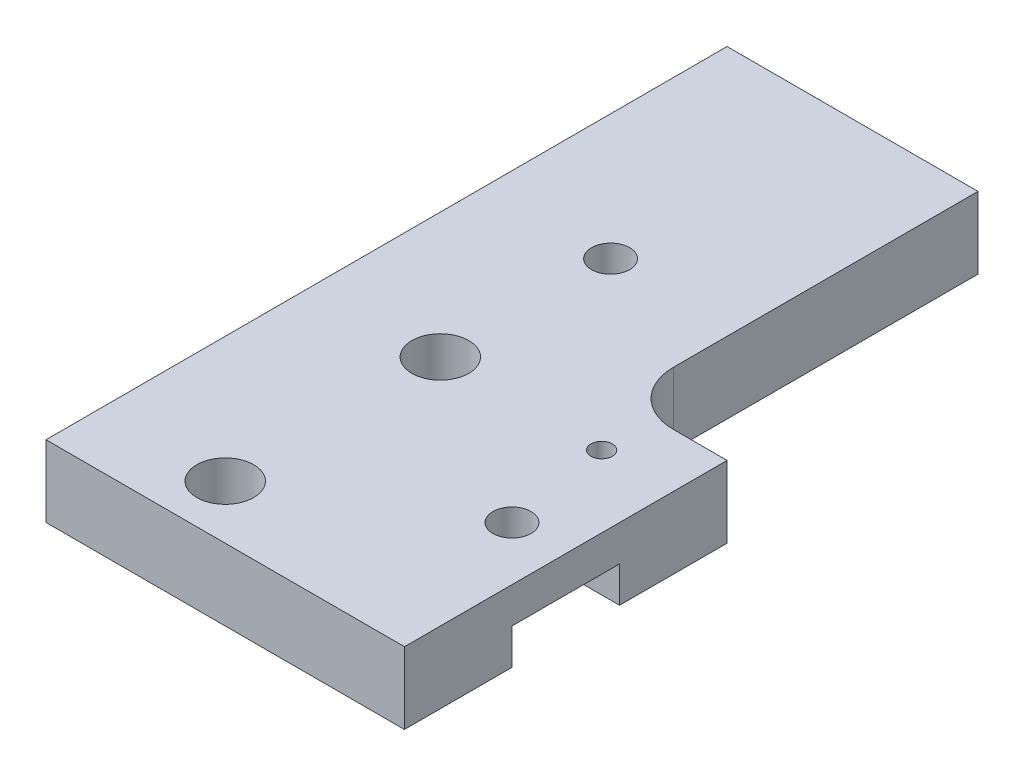
ISO-10303-21;
HEADER;
FILE_DESCRIPTION(('STEP AP214'),'2;1');
FILE_NAME('part.step','',(''),(''),'','','');
FILE_SCHEMA(('AUTOMOTIVE_DESIGN { 1 0 10303 214 1 1 1 1 }'));
ENDSEC;
DATA;
#1=APPLICATION_CONTEXT('core data for automotive mechanical design processes');
#2=APPLICATION_PROTOCOL_DEFINITION('international standard','automotive_design',2000,#1);
#3=PRODUCT_CONTEXT('',#1,'mechanical');
#4=PRODUCT('Part','Part','',(#3));
#5=PRODUCT_RELATED_PRODUCT_CATEGORY('part','',(#4));
#6=PRODUCT_DEFINITION_FORMATION('','',#4);
#7=PRODUCT_DEFINITION_CONTEXT('part definition',#1,'design');
#8=PRODUCT_DEFINITION('design','',#6,#7);
#9=PRODUCT_DEFINITION_SHAPE('','',#8);
#10=(LENGTH_UNIT() NAMED_UNIT(*) SI_UNIT(.MILLI.,.METRE.));
#11=(NAMED_UNIT(*) PLANE_ANGLE_UNIT() SI_UNIT($,.RADIAN.));
#12=(NAMED_UNIT(*) SI_UNIT($,.STERADIAN.) SOLID_ANGLE_UNIT());
#13=UNCERTAINTY_MEASURE_WITH_UNIT(LENGTH_MEASURE(1.E-05),#10,'distance_accuracy_value','');
#14=(GEOMETRIC_REPRESENTATION_CONTEXT(3) GLOBAL_UNCERTAINTY_ASSIGNED_CONTEXT((#13)) GLOBAL_UNIT_ASSIGNED_CONTEXT((#10,
#11,#12)) REPRESENTATION_CONTEXT('',''));
#15=CARTESIAN_POINT('',(0.,0.,0.));
#16=DIRECTION('',(0.,0.,1.));
#17=DIRECTION('',(1.,0.,0.));
#18=AXIS2_PLACEMENT_3D('',#15,#16,#17);
#19=CARTESIAN_POINT('',(0.,0.,0.));
#20=DIRECTION('',(0.,-1.,0.));
#21=DIRECTION('',(0.,0.,-1.));
#22=AXIS2_PLACEMENT_3D('',#19,#20,#21);
#23=PLANE('',#22);
#24=CARTESIAN_POINT('',(19.05,0.,-19.05));
#25=DIRECTION('',(0.,1.,0.));
#26=DIRECTION('',(0.,0.,1.));
#27=AXIS2_PLACEMENT_3D('',#24,#25,#26);
#28=CIRCLE('',#27,1.89864999999999);
#29=CARTESIAN_POINT('',(19.05,0.,-17.15135));
#30=VERTEX_POINT('',#29);
#31=EDGE_CURVE('E233',#30,#30,#28,.T.);
#32=ORIENTED_EDGE('',*,*,#31,.T.);
#33=EDGE_LOOP('',(#32));
#34=FACE_BOUND('',#33,.T.);
#35=DIRECTION('',(0.,0.,-1.));
#36=VECTOR('',#35,1.);
#37=CARTESIAN_POINT('',(12.7,0.,-92.075));
#38=LINE('',#37,#36);
#39=CARTESIAN_POINT('',(12.7,0.,-38.1));
#40=VERTEX_POINT('',#39);
#41=CARTESIAN_POINT('',(12.7,0.,-92.075));
#42=VERTEX_POINT('',#41);
#43=EDGE_CURVE('E160',#40,#42,#38,.T.);
#44=ORIENTED_EDGE('',*,*,#43,.F.);
#45=CARTESIAN_POINT('',(22.225,0.,-38.1));
#46=DIRECTION('',(0.,-1.,0.));
#47=DIRECTION('',(0.,0.,-1.));
#48=AXIS2_PLACEMENT_3D('',#45,#46,#47);
#49=CIRCLE('',#48,9.525);
#50=CARTESIAN_POINT('',(22.225,0.,-28.575));
#51=VERTEX_POINT('',#50);
#52=EDGE_CURVE('E45',#40,#51,#49,.F.);
#53=ORIENTED_EDGE('',*,*,#52,.T.);
#54=DIRECTION('',(-1.,0.,0.));
#55=VECTOR('',#54,1.);
#56=CARTESIAN_POINT('',(12.7,0.,-28.575));
#57=LINE('',#56,#55);
#58=CARTESIAN_POINT('',(31.75,0.,-28.575));
#59=VERTEX_POINT('',#58);
#60=EDGE_CURVE('E231',#59,#51,#57,.T.);
#61=ORIENTED_EDGE('',*,*,#60,.F.);
#62=DIRECTION('',(0.,0.,-1.));
#63=VECTOR('',#62,1.);
#64=CARTESIAN_POINT('',(31.75,0.,28.575));
#65=LINE('',#64,#63);
#66=CARTESIAN_POINT('',(31.75,0.,-9.525));
#67=VERTEX_POINT('',#66);
#68=EDGE_CURVE('E170',#67,#59,#65,.T.);
#69=ORIENTED_EDGE('',*,*,#68,.F.);
#70=DIRECTION('',(1.,0.,0.));
#71=VECTOR('',#70,1.);
#72=CARTESIAN_POINT('',(-31.75,0.,-9.525));
#73=LINE('',#72,#71);
#74=CARTESIAN_POINT('',(-31.75,0.,-9.525));
#75=VERTEX_POINT('',#74);
#76=EDGE_CURVE('E300',#75,#67,#73,.T.);
#77=ORIENTED_EDGE('',*,*,#76,.F.);
#78=DIRECTION('',(0.,0.,1.));
#79=VECTOR('',#78,1.);
#80=CARTESIAN_POINT('',(-31.75,0.,28.575));
#81=LINE('',#80,#79);
#82=CARTESIAN_POINT('',(-31.75,0.,-92.075));
#83=VERTEX_POINT('',#82);
#84=EDGE_CURVE('E181',#83,#75,#81,.T.);
#85=ORIENTED_EDGE('',*,*,#84,.F.);
#86=DIRECTION('',(-1.,0.,0.));
#87=VECTOR('',#86,1.);
#88=CARTESIAN_POINT('',(-31.75,0.,-92.075));
#89=LINE('',#88,#87);
#90=CARTESIAN_POINT('',(-19.05,0.,-92.075));
#91=VERTEX_POINT('',#90);
#92=EDGE_CURVE('E281',#91,#83,#89,.T.);
#93=ORIENTED_EDGE('',*,*,#92,.F.);
#94=DIRECTION('',(0.,0.,-1.));
#95=VECTOR('',#94,1.);
#96=CARTESIAN_POINT('',(-19.05,0.,-92.075));
#97=LINE('',#96,#95);
#98=CARTESIAN_POINT('',(-19.05,0.,-36.5125));
#99=VERTEX_POINT('',#98);
#100=EDGE_CURVE('E250',#99,#91,#97,.T.);
#101=ORIENTED_EDGE('',*,*,#100,.F.);
#102=CARTESIAN_POINT('',(-14.2875,0.,-36.5125));
#103=DIRECTION('',(0.,-1.,0.));
#104=DIRECTION('',(0.,0.,-1.));
#105=AXIS2_PLACEMENT_3D('',#102,#103,#104);
#106=CIRCLE('',#105,4.7625);
#107=CARTESIAN_POINT('',(-14.2875,0.,-31.75));
#108=VERTEX_POINT('',#107);
#109=EDGE_CURVE('E215',#99,#108,#106,.F.);
#110=ORIENTED_EDGE('',*,*,#109,.T.);
#111=DIRECTION('',(-1.,0.,0.));
#112=VECTOR('',#111,1.);
#113=CARTESIAN_POINT('',(-19.05,0.,-31.75));
#114=LINE('',#113,#112);
#115=CARTESIAN_POINT('',(-4.76250000000001,0.,-31.75));
#116=VERTEX_POINT('',#115);
#117=EDGE_CURVE('E251',#116,#108,#114,.T.);
#118=ORIENTED_EDGE('',*,*,#117,.F.);
#119=CARTESIAN_POINT('',(-4.7625,0.,-36.5125));
#120=DIRECTION('',(0.,-1.,0.));
#121=DIRECTION('',(0.,0.,-1.));
#122=AXIS2_PLACEMENT_3D('',#119,#120,#121);
#123=CIRCLE('',#122,4.7625);
#124=CARTESIAN_POINT('',(0.,0.,-36.5125));
#125=VERTEX_POINT('',#124);
#126=EDGE_CURVE('E213',#116,#125,#123,.F.);
#127=ORIENTED_EDGE('',*,*,#126,.T.);
#128=DIRECTION('',(0.,0.,1.));
#129=VECTOR('',#128,1.);
#130=CARTESIAN_POINT('',(0.,0.,-92.075));
#131=LINE('',#130,#129);
#132=CARTESIAN_POINT('',(0.,0.,-92.075));
#133=VERTEX_POINT('',#132);
#134=EDGE_CURVE('E255',#133,#125,#131,.T.);
#135=ORIENTED_EDGE('',*,*,#134,.F.);
#136=EDGE_CURVE('E230',#42,#133,#89,.T.);
#137=ORIENTED_EDGE('',*,*,#136,.F.);
#138=EDGE_LOOP('',(#44,#53,#61,#69,#77,#85,#93,#101,#110,#118,#127,#135,#137));
#139=FACE_BOUND('',#138,.T.);
#140=CARTESIAN_POINT('',(-9.525,0.,-19.05));
#141=DIRECTION('',(0.,1.,0.));
#142=DIRECTION('',(0.,0.,1.));
#143=AXIS2_PLACEMENT_3D('',#140,#141,#142);
#144=CIRCLE('',#143,5.0419);
#145=CARTESIAN_POINT('',(-9.525,0.,-14.0081));
#146=VERTEX_POINT('',#145);
#147=EDGE_CURVE('E286',#146,#146,#144,.T.);
#148=ORIENTED_EDGE('',*,*,#147,.T.);
#149=EDGE_LOOP('',(#148));
#150=FACE_BOUND('',#149,.T.);
#151=ADVANCED_FACE('F37',(#34,#139,#150),#23,.T.);
#152=CARTESIAN_POINT('',(31.75,12.7,28.575));
#153=DIRECTION('',(-1.,0.,0.));
#154=DIRECTION('',(0.,0.,1.));
#155=AXIS2_PLACEMENT_3D('',#152,#153,#154);
#156=PLANE('',#155);
#157=ORIENTED_EDGE('',*,*,#68,.T.);
#158=DIRECTION('',(0.,-1.,0.));
#159=VECTOR('',#158,1.);
#160=CARTESIAN_POINT('',(31.75,12.7,-28.575));
#161=LINE('',#160,#159);
#162=CARTESIAN_POINT('',(31.75,12.7,-28.575));
#163=VERTEX_POINT('',#162);
#164=EDGE_CURVE('E155',#163,#59,#161,.T.);
#165=ORIENTED_EDGE('',*,*,#164,.F.);
#166=DIRECTION('',(0.,0.,-1.));
#167=VECTOR('',#166,1.);
#168=CARTESIAN_POINT('',(31.75,12.7,28.575));
#169=LINE('',#168,#167);
#170=CARTESIAN_POINT('',(31.75,12.7,28.575));
#171=VERTEX_POINT('',#170);
#172=EDGE_CURVE('E167',#171,#163,#169,.T.);
#173=ORIENTED_EDGE('',*,*,#172,.F.);
#174=DIRECTION('',(0.,-1.,0.));
#175=VECTOR('',#174,1.);
#176=CARTESIAN_POINT('',(31.75,12.7,28.575));
#177=LINE('',#176,#175);
#178=CARTESIAN_POINT('',(31.75,0.,28.575));
#179=VERTEX_POINT('',#178);
#180=EDGE_CURVE('E188',#171,#179,#177,.T.);
#181=ORIENTED_EDGE('',*,*,#180,.T.);
#182=CARTESIAN_POINT('',(31.75,0.,9.525));
#183=VERTEX_POINT('',#182);
#184=EDGE_CURVE('E189',#179,#183,#65,.T.);
#185=ORIENTED_EDGE('',*,*,#184,.T.);
#186=DIRECTION('',(0.,-1.,0.));
#187=VECTOR('',#186,1.);
#188=CARTESIAN_POINT('',(31.75,6.35,9.525));
#189=LINE('',#188,#187);
#190=CARTESIAN_POINT('',(31.75,6.35,9.525));
#191=VERTEX_POINT('',#190);
#192=EDGE_CURVE('E184',#191,#183,#189,.T.);
#193=ORIENTED_EDGE('',*,*,#192,.F.);
#194=DIRECTION('',(0.,0.,1.));
#195=VECTOR('',#194,1.);
#196=CARTESIAN_POINT('',(31.75,6.35,-9.525));
#197=LINE('',#196,#195);
#198=CARTESIAN_POINT('',(31.75,6.35,-9.525));
#199=VERTEX_POINT('',#198);
#200=EDGE_CURVE('E296',#199,#191,#197,.T.);
#201=ORIENTED_EDGE('',*,*,#200,.F.);
#202=DIRECTION('',(0.,-1.,0.));
#203=VECTOR('',#202,1.);
#204=CARTESIAN_POINT('',(31.75,6.35,-9.525));
#205=LINE('',#204,#203);
#206=EDGE_CURVE('E310',#199,#67,#205,.T.);
#207=ORIENTED_EDGE('',*,*,#206,.T.);
#208=EDGE_LOOP('',(#157,#165,#173,#181,#185,#193,#201,#207));
#209=FACE_BOUND('',#208,.T.);
#210=ADVANCED_FACE('F165',(#209),#156,.F.);
#211=CARTESIAN_POINT('',(-31.75,12.7,28.575));
#212=DIRECTION('',(1.,0.,0.));
#213=DIRECTION('',(0.,0.,-1.));
#214=AXIS2_PLACEMENT_3D('',#211,#212,#213);
#215=PLANE('',#214);
#216=ORIENTED_EDGE('',*,*,#84,.T.);
#217=DIRECTION('',(0.,-1.,0.));
#218=VECTOR('',#217,1.);
#219=CARTESIAN_POINT('',(-31.75,6.35,-9.525));
#220=LINE('',#219,#218);
#221=CARTESIAN_POINT('',(-31.75,6.35,-9.525));
#222=VERTEX_POINT('',#221);
#223=EDGE_CURVE('E312',#222,#75,#220,.T.);
#224=ORIENTED_EDGE('',*,*,#223,.F.);
#225=DIRECTION('',(0.,0.,-1.));
#226=VECTOR('',#225,1.);
#227=CARTESIAN_POINT('',(-31.75,6.35,-9.525));
#228=LINE('',#227,#226);
#229=CARTESIAN_POINT('',(-31.75,6.35,9.525));
#230=VERTEX_POINT('',#229);
#231=EDGE_CURVE('E303',#230,#222,#228,.T.);
#232=ORIENTED_EDGE('',*,*,#231,.F.);
#233=DIRECTION('',(0.,-1.,0.));
#234=VECTOR('',#233,1.);
#235=CARTESIAN_POINT('',(-31.75,6.35,9.525));
#236=LINE('',#235,#234);
#237=CARTESIAN_POINT('',(-31.75,0.,9.525));
#238=VERTEX_POINT('',#237);
#239=EDGE_CURVE('E313',#230,#238,#236,.T.);
#240=ORIENTED_EDGE('',*,*,#239,.T.);
#241=CARTESIAN_POINT('',(-31.75,0.,28.575));
#242=VERTEX_POINT('',#241);
#243=EDGE_CURVE('E192',#238,#242,#81,.T.);
#244=ORIENTED_EDGE('',*,*,#243,.T.);
#245=DIRECTION('',(0.,-1.,0.));
#246=VECTOR('',#245,1.);
#247=CARTESIAN_POINT('',(-31.75,12.7,28.575));
#248=LINE('',#247,#246);
#249=CARTESIAN_POINT('',(-31.75,12.7,28.575));
#250=VERTEX_POINT('',#249);
#251=EDGE_CURVE('E196',#250,#242,#248,.T.);
#252=ORIENTED_EDGE('',*,*,#251,.F.);
#253=DIRECTION('',(0.,0.,1.));
#254=VECTOR('',#253,1.);
#255=CARTESIAN_POINT('',(-31.75,12.7,28.575));
#256=LINE('',#255,#254);
#257=CARTESIAN_POINT('',(-31.75,12.7,-92.075));
#258=VERTEX_POINT('',#257);
#259=EDGE_CURVE('E177',#258,#250,#256,.T.);
#260=ORIENTED_EDGE('',*,*,#259,.F.);
#261=DIRECTION('',(0.,1.,0.));
#262=VECTOR('',#261,1.);
#263=CARTESIAN_POINT('',(-31.75,12.7,-92.075));
#264=LINE('',#263,#262);
#265=EDGE_CURVE('E275',#83,#258,#264,.T.);
#266=ORIENTED_EDGE('',*,*,#265,.F.);
#267=EDGE_LOOP('',(#216,#224,#232,#240,#244,#252,#260,#266));
#268=FACE_BOUND('',#267,.T.);
#269=ADVANCED_FACE('F330',(#268),#215,.F.);
#270=CARTESIAN_POINT('',(-31.75,12.7,28.575));
#271=DIRECTION('',(0.,0.,-1.));
#272=DIRECTION('',(-1.,0.,0.));
#273=AXIS2_PLACEMENT_3D('',#270,#271,#272);
#274=PLANE('',#273);
#275=DIRECTION('',(1.,0.,0.));
#276=VECTOR('',#275,1.);
#277=CARTESIAN_POINT('',(-31.75,0.,28.575));
#278=LINE('',#277,#276);
#279=EDGE_CURVE('E178',#242,#179,#278,.T.);
#280=ORIENTED_EDGE('',*,*,#279,.T.);
#281=ORIENTED_EDGE('',*,*,#180,.F.);
#282=DIRECTION('',(1.,0.,0.));
#283=VECTOR('',#282,1.);
#284=CARTESIAN_POINT('',(-31.75,12.7,28.575));
#285=LINE('',#284,#283);
#286=EDGE_CURVE('E175',#250,#171,#285,.T.);
#287=ORIENTED_EDGE('',*,*,#286,.F.);
#288=ORIENTED_EDGE('',*,*,#251,.T.);
#289=EDGE_LOOP('',(#280,#281,#287,#288));
#290=FACE_BOUND('',#289,.T.);
#291=ADVANCED_FACE('F328',(#290),#274,.F.);
#292=CARTESIAN_POINT('',(0.,12.7,0.));
#293=DIRECTION('',(0.,-1.,0.));
#294=DIRECTION('',(0.,0.,-1.));
#295=AXIS2_PLACEMENT_3D('',#292,#293,#294);
#296=PLANE('',#295);
#297=CARTESIAN_POINT('',(19.05,12.7,-19.05));
#298=DIRECTION('',(0.,1.,0.));
#299=DIRECTION('',(0.,0.,1.));
#300=AXIS2_PLACEMENT_3D('',#297,#298,#299);
#301=CIRCLE('',#300,1.89864999999999);
#302=CARTESIAN_POINT('',(19.05,12.7,-17.15135));
#303=VERTEX_POINT('',#302);
#304=EDGE_CURVE('E606',#303,#303,#301,.T.);
#305=ORIENTED_EDGE('',*,*,#304,.F.);
#306=EDGE_LOOP('',(#305));
#307=FACE_BOUND('',#306,.T.);
#308=CARTESIAN_POINT('',(22.225,12.7,0.));
#309=DIRECTION('',(0.,-1.,0.));
#310=DIRECTION('',(0.,0.,-1.));
#311=AXIS2_PLACEMENT_3D('',#308,#309,#310);
#312=CIRCLE('',#311,3.3782);
#313=CARTESIAN_POINT('',(22.225,12.7,-3.3782));
#314=VERTEX_POINT('',#313);
#315=EDGE_CURVE('E241',#314,#314,#312,.T.);
#316=ORIENTED_EDGE('',*,*,#315,.T.);
#317=EDGE_LOOP('',(#316));
#318=FACE_BOUND('',#317,.T.);
#319=CARTESIAN_POINT('',(-9.525,12.7,-49.2125));
#320=DIRECTION('',(0.,-1.,0.));
#321=DIRECTION('',(0.,0.,-1.));
#322=AXIS2_PLACEMENT_3D('',#319,#320,#321);
#323=CIRCLE('',#322,3.3782);
#324=CARTESIAN_POINT('',(-9.525,12.7,-52.5907));
#325=VERTEX_POINT('',#324);
#326=EDGE_CURVE('E247',#325,#325,#323,.T.);
#327=ORIENTED_EDGE('',*,*,#326,.T.);
#328=EDGE_LOOP('',(#327));
#329=FACE_BOUND('',#328,.T.);
#330=CARTESIAN_POINT('',(-9.525,12.7,-19.05));
#331=DIRECTION('',(0.,1.,0.));
#332=DIRECTION('',(0.,0.,1.));
#333=AXIS2_PLACEMENT_3D('',#330,#331,#332);
#334=CIRCLE('',#333,5.0419);
#335=CARTESIAN_POINT('',(-9.525,12.7,-14.0081));
#336=VERTEX_POINT('',#335);
#337=EDGE_CURVE('E283',#336,#336,#334,.T.);
#338=ORIENTED_EDGE('',*,*,#337,.F.);
#339=EDGE_LOOP('',(#338));
#340=FACE_BOUND('',#339,.T.);
#341=CARTESIAN_POINT('',(-9.525,12.7,19.05));
#342=DIRECTION('',(0.,1.,0.));
#343=DIRECTION('',(0.,0.,1.));
#344=AXIS2_PLACEMENT_3D('',#341,#342,#343);
#345=CIRCLE('',#344,5.0419);
#346=CARTESIAN_POINT('',(-9.525,12.7,24.0919));
#347=VERTEX_POINT('',#346);
#348=EDGE_CURVE('E289',#347,#347,#345,.T.);
#349=ORIENTED_EDGE('',*,*,#348,.F.);
#350=EDGE_LOOP('',(#349));
#351=FACE_BOUND('',#350,.T.);
#352=DIRECTION('',(-1.,0.,0.));
#353=VECTOR('',#352,1.);
#354=CARTESIAN_POINT('',(12.7,12.7,-28.575));
#355=LINE('',#354,#353);
#356=CARTESIAN_POINT('',(22.225,12.7,-28.575));
#357=VERTEX_POINT('',#356);
#358=EDGE_CURVE('E152',#163,#357,#355,.T.);
#359=ORIENTED_EDGE('',*,*,#358,.T.);
#360=CARTESIAN_POINT('',(22.225,12.7,-38.1));
#361=DIRECTION('',(0.,-1.,0.));
#362=DIRECTION('',(0.,0.,-1.));
#363=AXIS2_PLACEMENT_3D('',#360,#361,#362);
#364=CIRCLE('',#363,9.525);
#365=CARTESIAN_POINT('',(12.7,12.7,-38.1));
#366=VERTEX_POINT('',#365);
#367=EDGE_CURVE('E11',#357,#366,#364,.T.);
#368=ORIENTED_EDGE('',*,*,#367,.T.);
#369=DIRECTION('',(0.,0.,-1.));
#370=VECTOR('',#369,1.);
#371=CARTESIAN_POINT('',(12.7,12.7,-92.075));
#372=LINE('',#371,#370);
#373=CARTESIAN_POINT('',(12.7,12.7,-92.075));
#374=VERTEX_POINT('',#373);
#375=EDGE_CURVE('E159',#366,#374,#372,.T.);
#376=ORIENTED_EDGE('',*,*,#375,.T.);
#377=DIRECTION('',(1.,0.,0.));
#378=VECTOR('',#377,1.);
#379=CARTESIAN_POINT('',(-31.75,12.7,-92.075));
#380=LINE('',#379,#378);
#381=EDGE_CURVE('E278',#258,#374,#380,.T.);
#382=ORIENTED_EDGE('',*,*,#381,.F.);
#383=ORIENTED_EDGE('',*,*,#259,.T.);
#384=ORIENTED_EDGE('',*,*,#286,.T.);
#385=ORIENTED_EDGE('',*,*,#172,.T.);
#386=EDGE_LOOP('',(#359,#368,#376,#382,#383,#384,#385));
#387=FACE_BOUND('',#386,.T.);
#388=ADVANCED_FACE('F173',(#307,#318,#329,#340,#351,#387),#296,.F.);
#389=CARTESIAN_POINT('',(-9.525,0.,19.05));
#390=DIRECTION('',(0.,1.,0.));
#391=DIRECTION('',(0.,0.,1.));
#392=AXIS2_PLACEMENT_3D('',#389,#390,#391);
#393=CIRCLE('',#392,5.0419);
#394=CARTESIAN_POINT('',(-9.525,0.,24.0919));
#395=VERTEX_POINT('',#394);
#396=EDGE_CURVE('E292',#395,#395,#393,.T.);
#397=ORIENTED_EDGE('',*,*,#396,.T.);
#398=EDGE_LOOP('',(#397));
#399=FACE_BOUND('',#398,.T.);
#400=DIRECTION('',(-1.,0.,0.));
#401=VECTOR('',#400,1.);
#402=CARTESIAN_POINT('',(-31.75,0.,9.525));
#403=LINE('',#402,#401);
#404=EDGE_CURVE('E295',#183,#238,#403,.T.);
#405=ORIENTED_EDGE('',*,*,#404,.F.);
#406=ORIENTED_EDGE('',*,*,#184,.F.);
#407=ORIENTED_EDGE('',*,*,#279,.F.);
#408=ORIENTED_EDGE('',*,*,#243,.F.);
#409=EDGE_LOOP('',(#405,#406,#407,#408));
#410=FACE_BOUND('',#409,.T.);
#411=ADVANCED_FACE('F325',(#399,#410),#23,.T.);
#412=CARTESIAN_POINT('',(-31.75,6.35,-9.525));
#413=DIRECTION('',(0.,0.,-1.));
#414=DIRECTION('',(-1.,0.,0.));
#415=AXIS2_PLACEMENT_3D('',#412,#413,#414);
#416=PLANE('',#415);
#417=ORIENTED_EDGE('',*,*,#76,.T.);
#418=ORIENTED_EDGE('',*,*,#206,.F.);
#419=DIRECTION('',(1.,0.,0.));
#420=VECTOR('',#419,1.);
#421=CARTESIAN_POINT('',(-31.75,6.35,-9.525));
#422=LINE('',#421,#420);
#423=EDGE_CURVE('E305',#222,#199,#422,.T.);
#424=ORIENTED_EDGE('',*,*,#423,.F.);
#425=ORIENTED_EDGE('',*,*,#223,.T.);
#426=EDGE_LOOP('',(#417,#418,#424,#425));
#427=FACE_BOUND('',#426,.T.);
#428=ADVANCED_FACE('F344',(#427),#416,.F.);
#429=CARTESIAN_POINT('',(-31.75,6.35,9.525));
#430=DIRECTION('',(0.,0.,1.));
#431=DIRECTION('',(1.,0.,0.));
#432=AXIS2_PLACEMENT_3D('',#429,#430,#431);
#433=PLANE('',#432);
#434=ORIENTED_EDGE('',*,*,#404,.T.);
#435=ORIENTED_EDGE('',*,*,#239,.F.);
#436=DIRECTION('',(-1.,0.,0.));
#437=VECTOR('',#436,1.);
#438=CARTESIAN_POINT('',(-31.75,6.35,9.525));
#439=LINE('',#438,#437);
#440=EDGE_CURVE('E299',#191,#230,#439,.T.);
#441=ORIENTED_EDGE('',*,*,#440,.F.);
#442=ORIENTED_EDGE('',*,*,#192,.T.);
#443=EDGE_LOOP('',(#434,#435,#441,#442));
#444=FACE_BOUND('',#443,.T.);
#445=ADVANCED_FACE('F321',(#444),#433,.F.);
#446=CARTESIAN_POINT('',(0.,6.35,0.));
#447=DIRECTION('',(0.,1.,0.));
#448=DIRECTION('',(0.,0.,1.));
#449=AXIS2_PLACEMENT_3D('',#446,#447,#448);
#450=PLANE('',#449);
#451=CARTESIAN_POINT('',(22.225,6.35,0.));
#452=DIRECTION('',(0.,-1.,0.));
#453=DIRECTION('',(0.,0.,-1.));
#454=AXIS2_PLACEMENT_3D('',#451,#452,#453);
#455=CIRCLE('',#454,3.3782);
#456=CARTESIAN_POINT('',(22.225,6.35,-3.3782));
#457=VERTEX_POINT('',#456);
#458=EDGE_CURVE('E237',#457,#457,#455,.T.);
#459=ORIENTED_EDGE('',*,*,#458,.F.);
#460=EDGE_LOOP('',(#459));
#461=FACE_BOUND('',#460,.T.);
#462=ORIENTED_EDGE('',*,*,#200,.T.);
#463=ORIENTED_EDGE('',*,*,#440,.T.);
#464=ORIENTED_EDGE('',*,*,#231,.T.);
#465=ORIENTED_EDGE('',*,*,#423,.T.);
#466=EDGE_LOOP('',(#462,#463,#464,#465));
#467=FACE_BOUND('',#466,.T.);
#468=ADVANCED_FACE('F346',(#461,#467),#450,.F.);
#469=CARTESIAN_POINT('',(-9.525,12.7,19.05));
#470=DIRECTION('',(0.,1.,0.));
#471=DIRECTION('',(0.,0.,1.));
#472=AXIS2_PLACEMENT_3D('',#469,#470,#471);
#473=CYLINDRICAL_SURFACE('',#472,5.0419);
#474=ORIENTED_EDGE('',*,*,#396,.F.);
#475=EDGE_LOOP('',(#474));
#476=FACE_BOUND('',#475,.T.);
#477=ORIENTED_EDGE('',*,*,#348,.T.);
#478=EDGE_LOOP('',(#477));
#479=FACE_BOUND('',#478,.T.);
#480=ADVANCED_FACE('F376',(#476,#479),#473,.F.);
#481=CARTESIAN_POINT('',(-9.525,12.7,-19.05));
#482=DIRECTION('',(0.,1.,0.));
#483=DIRECTION('',(0.,0.,1.));
#484=AXIS2_PLACEMENT_3D('',#481,#482,#483);
#485=CYLINDRICAL_SURFACE('',#484,5.0419);
#486=ORIENTED_EDGE('',*,*,#147,.F.);
#487=EDGE_LOOP('',(#486));
#488=FACE_BOUND('',#487,.T.);
#489=ORIENTED_EDGE('',*,*,#337,.T.);
#490=EDGE_LOOP('',(#489));
#491=FACE_BOUND('',#490,.T.);
#492=ADVANCED_FACE('F379',(#488,#491),#485,.F.);
#493=CARTESIAN_POINT('',(0.,0.,-92.075));
#494=DIRECTION('',(0.,0.,1.));
#495=DIRECTION('',(1.,0.,0.));
#496=AXIS2_PLACEMENT_3D('',#493,#494,#495);
#497=PLANE('',#496);
#498=ORIENTED_EDGE('',*,*,#381,.T.);
#499=DIRECTION('',(0.,-1.,0.));
#500=VECTOR('',#499,1.);
#501=CARTESIAN_POINT('',(12.7,12.7,-92.075));
#502=LINE('',#501,#500);
#503=EDGE_CURVE('E171',#374,#42,#502,.T.);
#504=ORIENTED_EDGE('',*,*,#503,.T.);
#505=ORIENTED_EDGE('',*,*,#136,.T.);
#506=DIRECTION('',(0.,-1.,0.));
#507=VECTOR('',#506,1.);
#508=CARTESIAN_POINT('',(0.,69.6114268334188,-92.075));
#509=LINE('',#508,#507);
#510=CARTESIAN_POINT('',(0.,6.34999999999999,-92.075));
#511=VERTEX_POINT('',#510);
#512=EDGE_CURVE('E261',#511,#133,#509,.T.);
#513=ORIENTED_EDGE('',*,*,#512,.F.);
#514=DIRECTION('',(1.,0.,0.));
#515=VECTOR('',#514,1.);
#516=CARTESIAN_POINT('',(-19.05,6.34999999999999,-92.075));
#517=LINE('',#516,#515);
#518=CARTESIAN_POINT('',(-19.05,6.34999999999999,-92.075));
#519=VERTEX_POINT('',#518);
#520=EDGE_CURVE('E254',#519,#511,#517,.T.);
#521=ORIENTED_EDGE('',*,*,#520,.F.);
#522=DIRECTION('',(0.,-1.,0.));
#523=VECTOR('',#522,1.);
#524=CARTESIAN_POINT('',(-19.05,69.6114268334188,-92.075));
#525=LINE('',#524,#523);
#526=EDGE_CURVE('E264',#519,#91,#525,.T.);
#527=ORIENTED_EDGE('',*,*,#526,.T.);
#528=ORIENTED_EDGE('',*,*,#92,.T.);
#529=ORIENTED_EDGE('',*,*,#265,.T.);
#530=EDGE_LOOP('',(#498,#504,#505,#513,#521,#527,#528,#529));
#531=FACE_BOUND('',#530,.T.);
#532=ADVANCED_FACE('F334',(#531),#497,.F.);
#533=CARTESIAN_POINT('',(0.,6.35,0.));
#534=DIRECTION('',(0.,1.,0.));
#535=DIRECTION('',(0.,0.,1.));
#536=AXIS2_PLACEMENT_3D('',#533,#534,#535);
#537=PLANE('',#536);
#538=CARTESIAN_POINT('',(-9.525,6.35,-49.2125));
#539=DIRECTION('',(0.,-1.,0.));
#540=DIRECTION('',(0.,0.,-1.));
#541=AXIS2_PLACEMENT_3D('',#538,#539,#540);
#542=CIRCLE('',#541,3.3782);
#543=CARTESIAN_POINT('',(-9.525,6.35,-52.5907));
#544=VERTEX_POINT('',#543);
#545=EDGE_CURVE('E244',#544,#544,#542,.T.);
#546=ORIENTED_EDGE('',*,*,#545,.F.);
#547=EDGE_LOOP('',(#546));
#548=FACE_BOUND('',#547,.T.);
#549=DIRECTION('',(0.,0.,1.));
#550=VECTOR('',#549,1.);
#551=CARTESIAN_POINT('',(0.,6.34999999999999,-92.075));
#552=LINE('',#551,#550);
#553=CARTESIAN_POINT('',(0.,6.34999999999999,-36.5125));
#554=VERTEX_POINT('',#553);
#555=EDGE_CURVE('E268',#511,#554,#552,.T.);
#556=ORIENTED_EDGE('',*,*,#555,.T.);
#557=CARTESIAN_POINT('',(-4.7625,6.34999999999999,-36.5125));
#558=DIRECTION('',(0.,1.,0.));
#559=DIRECTION('',(0.,0.,1.));
#560=AXIS2_PLACEMENT_3D('',#557,#558,#559);
#561=CIRCLE('',#560,4.7625);
#562=CARTESIAN_POINT('',(-4.7625,6.34999999999999,-31.75));
#563=VERTEX_POINT('',#562);
#564=EDGE_CURVE('E208',#554,#563,#561,.F.);
#565=ORIENTED_EDGE('',*,*,#564,.T.);
#566=DIRECTION('',(-1.,0.,0.));
#567=VECTOR('',#566,1.);
#568=CARTESIAN_POINT('',(-19.05,6.34999999999999,-31.75));
#569=LINE('',#568,#567);
#570=CARTESIAN_POINT('',(-14.2875,6.34999999999999,-31.75));
#571=VERTEX_POINT('',#570);
#572=EDGE_CURVE('E265',#563,#571,#569,.T.);
#573=ORIENTED_EDGE('',*,*,#572,.T.);
#574=CARTESIAN_POINT('',(-14.2875,6.34999999999999,-36.5125));
#575=DIRECTION('',(0.,1.,0.));
#576=DIRECTION('',(0.,0.,1.));
#577=AXIS2_PLACEMENT_3D('',#574,#575,#576);
#578=CIRCLE('',#577,4.7625);
#579=CARTESIAN_POINT('',(-19.05,6.34999999999999,-36.5125));
#580=VERTEX_POINT('',#579);
#581=EDGE_CURVE('E206',#571,#580,#578,.F.);
#582=ORIENTED_EDGE('',*,*,#581,.T.);
#583=DIRECTION('',(0.,0.,-1.));
#584=VECTOR('',#583,1.);
#585=CARTESIAN_POINT('',(-19.05,6.34999999999999,-92.075));
#586=LINE('',#585,#584);
#587=EDGE_CURVE('E262',#580,#519,#586,.T.);
#588=ORIENTED_EDGE('',*,*,#587,.T.);
#589=ORIENTED_EDGE('',*,*,#520,.T.);
#590=EDGE_LOOP('',(#556,#565,#573,#582,#588,#589));
#591=FACE_BOUND('',#590,.T.);
#592=ADVANCED_FACE('F414',(#548,#591),#537,.F.);
#593=CARTESIAN_POINT('',(0.,69.6114268334188,-92.075));
#594=DIRECTION('',(1.,0.,0.));
#595=DIRECTION('',(0.,0.,-1.));
#596=AXIS2_PLACEMENT_3D('',#593,#594,#595);
#597=PLANE('',#596);
#598=ORIENTED_EDGE('',*,*,#134,.T.);
#599=DIRECTION('',(0.,-1.,0.));
#600=VECTOR('',#599,1.);
#601=CARTESIAN_POINT('',(0.,6.34999999999999,-36.5125));
#602=LINE('',#601,#600);
#603=EDGE_CURVE('E204',#125,#554,#602,.F.);
#604=ORIENTED_EDGE('',*,*,#603,.T.);
#605=ORIENTED_EDGE('',*,*,#555,.F.);
#606=ORIENTED_EDGE('',*,*,#512,.T.);
#607=EDGE_LOOP('',(#598,#604,#605,#606));
#608=FACE_BOUND('',#607,.T.);
#609=ADVANCED_FACE('F419',(#608),#597,.F.);
#610=CARTESIAN_POINT('',(-19.05,69.6114268334188,-31.75));
#611=DIRECTION('',(0.,0.,1.));
#612=DIRECTION('',(1.,0.,0.));
#613=AXIS2_PLACEMENT_3D('',#610,#611,#612);
#614=PLANE('',#613);
#615=ORIENTED_EDGE('',*,*,#572,.F.);
#616=DIRECTION('',(0.,-1.,0.));
#617=VECTOR('',#616,1.);
#618=CARTESIAN_POINT('',(-4.7625,0.,-31.75));
#619=LINE('',#618,#617);
#620=EDGE_CURVE('E201',#563,#116,#619,.T.);
#621=ORIENTED_EDGE('',*,*,#620,.T.);
#622=ORIENTED_EDGE('',*,*,#117,.T.);
#623=DIRECTION('',(0.,-1.,0.));
#624=VECTOR('',#623,1.);
#625=CARTESIAN_POINT('',(-14.2875,6.34999999999999,-31.75));
#626=LINE('',#625,#624);
#627=EDGE_CURVE('E199',#108,#571,#626,.F.);
#628=ORIENTED_EDGE('',*,*,#627,.T.);
#629=EDGE_LOOP('',(#615,#621,#622,#628));
#630=FACE_BOUND('',#629,.T.);
#631=ADVANCED_FACE('F518',(#630),#614,.F.);
#632=CARTESIAN_POINT('',(-19.05,69.6114268334188,-92.075));
#633=DIRECTION('',(-1.,0.,0.));
#634=DIRECTION('',(0.,0.,1.));
#635=AXIS2_PLACEMENT_3D('',#632,#633,#634);
#636=PLANE('',#635);
#637=ORIENTED_EDGE('',*,*,#587,.F.);
#638=DIRECTION('',(0.,-1.,0.));
#639=VECTOR('',#638,1.);
#640=CARTESIAN_POINT('',(-19.05,0.,-36.5125));
#641=LINE('',#640,#639);
#642=EDGE_CURVE('E210',#580,#99,#641,.T.);
#643=ORIENTED_EDGE('',*,*,#642,.T.);
#644=ORIENTED_EDGE('',*,*,#100,.T.);
#645=ORIENTED_EDGE('',*,*,#526,.F.);
#646=EDGE_LOOP('',(#637,#643,#644,#645));
#647=FACE_BOUND('',#646,.T.);
#648=ADVANCED_FACE('F528',(#647),#636,.F.);
#649=CARTESIAN_POINT('',(-4.7625,69.6114268334188,-36.5125));
#650=DIRECTION('',(0.,1.,0.));
#651=DIRECTION('',(0.,0.,1.));
#652=AXIS2_PLACEMENT_3D('',#649,#650,#651);
#653=CYLINDRICAL_SURFACE('',#652,4.7625);
#654=ORIENTED_EDGE('',*,*,#564,.F.);
#655=ORIENTED_EDGE('',*,*,#603,.F.);
#656=ORIENTED_EDGE('',*,*,#126,.F.);
#657=ORIENTED_EDGE('',*,*,#620,.F.);
#658=EDGE_LOOP('',(#654,#655,#656,#657));
#659=FACE_BOUND('',#658,.T.);
#660=ADVANCED_FACE('F537',(#659),#653,.F.);
#661=CARTESIAN_POINT('',(-14.2875,69.6114268334188,-36.5125));
#662=DIRECTION('',(0.,1.,0.));
#663=DIRECTION('',(0.,0.,1.));
#664=AXIS2_PLACEMENT_3D('',#661,#662,#663);
#665=CYLINDRICAL_SURFACE('',#664,4.7625);
#666=ORIENTED_EDGE('',*,*,#581,.F.);
#667=ORIENTED_EDGE('',*,*,#627,.F.);
#668=ORIENTED_EDGE('',*,*,#109,.F.);
#669=ORIENTED_EDGE('',*,*,#642,.F.);
#670=EDGE_LOOP('',(#666,#667,#668,#669));
#671=FACE_BOUND('',#670,.T.);
#672=ADVANCED_FACE('F409',(#671),#665,.F.);
#673=CARTESIAN_POINT('',(-9.525,6.35,-49.2125));
#674=DIRECTION('',(0.,-1.,0.));
#675=DIRECTION('',(0.,0.,-1.));
#676=AXIS2_PLACEMENT_3D('',#673,#674,#675);
#677=CYLINDRICAL_SURFACE('',#676,3.3782);
#678=ORIENTED_EDGE('',*,*,#326,.F.);
#679=EDGE_LOOP('',(#678));
#680=FACE_BOUND('',#679,.T.);
#681=ORIENTED_EDGE('',*,*,#545,.T.);
#682=EDGE_LOOP('',(#681));
#683=FACE_BOUND('',#682,.T.);
#684=ADVANCED_FACE('F429',(#680,#683),#677,.F.);
#685=CARTESIAN_POINT('',(22.225,6.35,0.));
#686=DIRECTION('',(0.,-1.,0.));
#687=DIRECTION('',(0.,0.,-1.));
#688=AXIS2_PLACEMENT_3D('',#685,#686,#687);
#689=CYLINDRICAL_SURFACE('',#688,3.3782);
#690=ORIENTED_EDGE('',*,*,#315,.F.);
#691=EDGE_LOOP('',(#690));
#692=FACE_BOUND('',#691,.T.);
#693=ORIENTED_EDGE('',*,*,#458,.T.);
#694=EDGE_LOOP('',(#693));
#695=FACE_BOUND('',#694,.T.);
#696=ADVANCED_FACE('F434',(#692,#695),#689,.F.);
#697=CARTESIAN_POINT('',(12.7,12.7,-92.075));
#698=DIRECTION('',(-1.,0.,0.));
#699=DIRECTION('',(0.,0.,1.));
#700=AXIS2_PLACEMENT_3D('',#697,#698,#699);
#701=PLANE('',#700);
#702=ORIENTED_EDGE('',*,*,#375,.F.);
#703=DIRECTION('',(0.,-1.,0.));
#704=VECTOR('',#703,1.);
#705=CARTESIAN_POINT('',(12.7,0.,-38.1));
#706=LINE('',#705,#704);
#707=EDGE_CURVE('E217',#366,#40,#706,.T.);
#708=ORIENTED_EDGE('',*,*,#707,.T.);
#709=ORIENTED_EDGE('',*,*,#43,.T.);
#710=ORIENTED_EDGE('',*,*,#503,.F.);
#711=EDGE_LOOP('',(#702,#708,#709,#710));
#712=FACE_BOUND('',#711,.T.);
#713=ADVANCED_FACE('F223',(#712),#701,.F.);
#714=CARTESIAN_POINT('',(12.7,12.7,-28.575));
#715=DIRECTION('',(0.,0.,1.));
#716=DIRECTION('',(1.,0.,0.));
#717=AXIS2_PLACEMENT_3D('',#714,#715,#716);
#718=PLANE('',#717);
#719=ORIENTED_EDGE('',*,*,#60,.T.);
#720=DIRECTION('',(0.,-1.,0.));
#721=VECTOR('',#720,1.);
#722=CARTESIAN_POINT('',(22.225,12.7,-28.575));
#723=LINE('',#722,#721);
#724=EDGE_CURVE('E52',#51,#357,#723,.F.);
#725=ORIENTED_EDGE('',*,*,#724,.T.);
#726=ORIENTED_EDGE('',*,*,#358,.F.);
#727=ORIENTED_EDGE('',*,*,#164,.T.);
#728=EDGE_LOOP('',(#719,#725,#726,#727));
#729=FACE_BOUND('',#728,.T.);
#730=ADVANCED_FACE('F154',(#729),#718,.F.);
#731=CARTESIAN_POINT('',(22.225,12.7,-38.1));
#732=DIRECTION('',(0.,1.,0.));
#733=DIRECTION('',(0.,0.,1.));
#734=AXIS2_PLACEMENT_3D('',#731,#732,#733);
#735=CYLINDRICAL_SURFACE('',#734,9.525);
#736=ORIENTED_EDGE('',*,*,#367,.F.);
#737=ORIENTED_EDGE('',*,*,#724,.F.);
#738=ORIENTED_EDGE('',*,*,#52,.F.);
#739=ORIENTED_EDGE('',*,*,#707,.F.);
#740=EDGE_LOOP('',(#736,#737,#738,#739));
#741=FACE_BOUND('',#740,.T.);
#742=ADVANCED_FACE('F39',(#741),#735,.F.);
#743=CARTESIAN_POINT('',(19.05,12.7,-19.05));
#744=DIRECTION('',(0.,1.,0.));
#745=DIRECTION('',(0.,0.,1.));
#746=AXIS2_PLACEMENT_3D('',#743,#744,#745);
#747=CYLINDRICAL_SURFACE('',#746,1.89864999999999);
#748=ORIENTED_EDGE('',*,*,#31,.F.);
#749=EDGE_LOOP('',(#748));
#750=FACE_BOUND('',#749,.T.);
#751=ORIENTED_EDGE('',*,*,#304,.T.);
#752=EDGE_LOOP('',(#751));
#753=FACE_BOUND('',#752,.T.);
#754=ADVANCED_FACE('F348',(#750,#753),#747,.F.);
#755=CLOSED_SHELL('',(#151,#210,#269,#291,#388,#411,#428,#445,#468,#480,#492,#532,#592,#609,
#631,#648,#660,#672,#684,#696,#713,#730,#742,#754));
#756=MANIFOLD_SOLID_BREP('B2',#755);
#757=ADVANCED_BREP_SHAPE_REPRESENTATION('',(#18,#756),#14);
#758=SHAPE_DEFINITION_REPRESENTATION(#9,#757);
ENDSEC;
END-ISO-10303-21;
